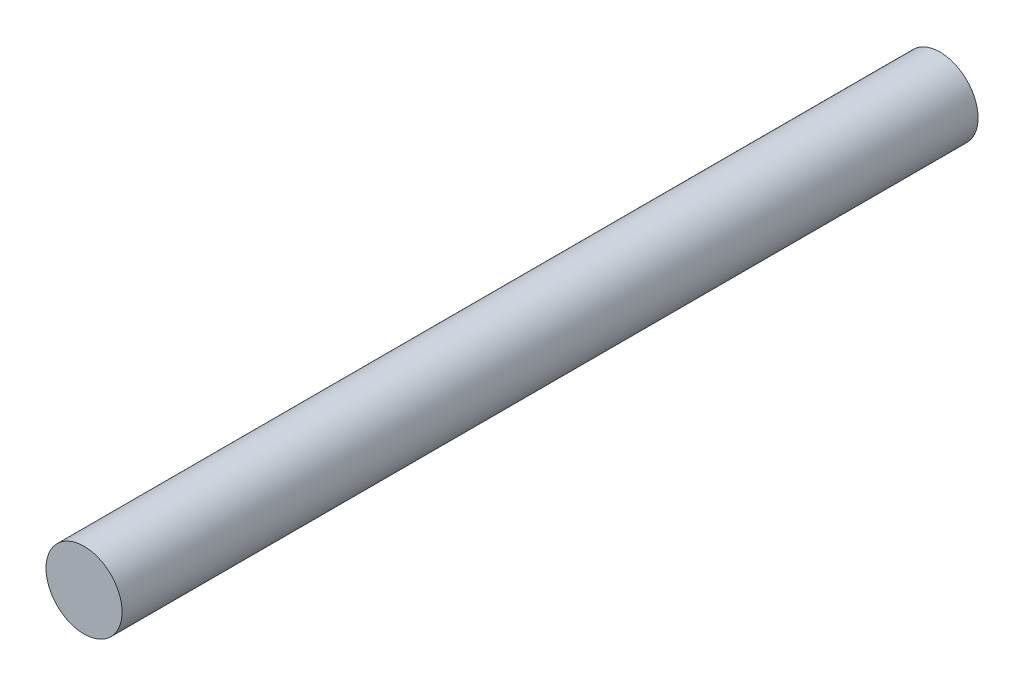
ISO-10303-21;
HEADER;
FILE_DESCRIPTION(('STEP AP214'),'2;1');
FILE_NAME('part.step','',(''),(''),'','','');
FILE_SCHEMA(('AUTOMOTIVE_DESIGN { 1 0 10303 214 1 1 1 1 }'));
ENDSEC;
DATA;
#1=APPLICATION_CONTEXT('core data for automotive mechanical design processes');
#2=APPLICATION_PROTOCOL_DEFINITION('international standard','automotive_design',2000,#1);
#3=PRODUCT_CONTEXT('',#1,'mechanical');
#4=PRODUCT('Part','Part','',(#3));
#5=PRODUCT_RELATED_PRODUCT_CATEGORY('part','',(#4));
#6=PRODUCT_DEFINITION_FORMATION('','',#4);
#7=PRODUCT_DEFINITION_CONTEXT('part definition',#1,'design');
#8=PRODUCT_DEFINITION('design','',#6,#7);
#9=PRODUCT_DEFINITION_SHAPE('','',#8);
#10=(LENGTH_UNIT() NAMED_UNIT(*) SI_UNIT(.MILLI.,.METRE.));
#11=(NAMED_UNIT(*) PLANE_ANGLE_UNIT() SI_UNIT($,.RADIAN.));
#12=(NAMED_UNIT(*) SI_UNIT($,.STERADIAN.) SOLID_ANGLE_UNIT());
#13=UNCERTAINTY_MEASURE_WITH_UNIT(LENGTH_MEASURE(1.E-05),#10,'distance_accuracy_value','');
#14=(GEOMETRIC_REPRESENTATION_CONTEXT(3) GLOBAL_UNCERTAINTY_ASSIGNED_CONTEXT((#13)) GLOBAL_UNIT_ASSIGNED_CONTEXT((#10,
#11,#12)) REPRESENTATION_CONTEXT('',''));
#15=CARTESIAN_POINT('',(0.,0.,0.));
#16=DIRECTION('',(0.,0.,1.));
#17=DIRECTION('',(1.,0.,0.));
#18=AXIS2_PLACEMENT_3D('',#15,#16,#17);
#19=CARTESIAN_POINT('',(0.,0.,45.));
#20=DIRECTION('',(0.,0.,-1.));
#21=DIRECTION('',(-1.,0.,0.));
#22=AXIS2_PLACEMENT_3D('',#19,#20,#21);
#23=CYLINDRICAL_SURFACE('',#22,2.);
#24=CARTESIAN_POINT('',(0.,0.,45.));
#25=DIRECTION('',(0.,0.,1.));
#26=DIRECTION('',(1.,0.,0.));
#27=AXIS2_PLACEMENT_3D('',#24,#25,#26);
#28=CIRCLE('',#27,2.);
#29=CARTESIAN_POINT('',(-2.,0.,45.));
#30=VERTEX_POINT('',#29);
#31=EDGE_CURVE('E10',#30,#30,#28,.T.);
#32=CARTESIAN_POINT('',(0.,0.,0.));
#33=DIRECTION('',(0.,0.,1.));
#34=DIRECTION('',(1.,0.,0.));
#35=AXIS2_PLACEMENT_3D('',#32,#33,#34);
#36=CIRCLE('',#35,2.);
#37=CARTESIAN_POINT('',(-2.,0.,0.));
#38=VERTEX_POINT('',#37);
#39=EDGE_CURVE('E34',#38,#38,#36,.T.);
#40=CARTESIAN_POINT('',(-2.,0.,45.));
#41=CARTESIAN_POINT('',(-2.,0.,44.53125));
#42=CARTESIAN_POINT('',(-2.,0.,44.0625));
#43=CARTESIAN_POINT('',(-2.,0.,43.125));
#44=CARTESIAN_POINT('',(-2.,0.,42.65625));
#45=CARTESIAN_POINT('',(-2.,0.,41.71875));
#46=CARTESIAN_POINT('',(-2.,0.,41.25));
#47=CARTESIAN_POINT('',(-2.,0.,40.3125));
#48=CARTESIAN_POINT('',(-2.,0.,39.84375));
#49=CARTESIAN_POINT('',(-2.,0.,38.90625));
#50=CARTESIAN_POINT('',(-2.,0.,38.4375));
#51=CARTESIAN_POINT('',(-2.,0.,37.5));
#52=CARTESIAN_POINT('',(-2.,0.,37.03125));
#53=CARTESIAN_POINT('',(-2.,0.,36.09375));
#54=CARTESIAN_POINT('',(-2.,0.,35.625));
#55=CARTESIAN_POINT('',(-2.,0.,34.6875));
#56=CARTESIAN_POINT('',(-2.,0.,34.21875));
#57=CARTESIAN_POINT('',(-2.,0.,33.28125));
#58=CARTESIAN_POINT('',(-2.,0.,32.8125));
#59=CARTESIAN_POINT('',(-2.,0.,31.875));
#60=CARTESIAN_POINT('',(-2.,0.,31.40625));
#61=CARTESIAN_POINT('',(-2.,0.,30.46875));
#62=CARTESIAN_POINT('',(-2.,0.,30.));
#63=CARTESIAN_POINT('',(-2.,0.,29.0625));
#64=CARTESIAN_POINT('',(-2.,0.,28.59375));
#65=CARTESIAN_POINT('',(-2.,0.,27.65625));
#66=CARTESIAN_POINT('',(-2.,0.,27.1875));
#67=CARTESIAN_POINT('',(-2.,0.,26.25));
#68=CARTESIAN_POINT('',(-2.,0.,25.78125));
#69=CARTESIAN_POINT('',(-2.,0.,24.84375));
#70=CARTESIAN_POINT('',(-2.,0.,24.375));
#71=CARTESIAN_POINT('',(-2.,0.,23.4375));
#72=CARTESIAN_POINT('',(-2.,0.,22.96875));
#73=CARTESIAN_POINT('',(-2.,0.,22.03125));
#74=CARTESIAN_POINT('',(-2.,0.,21.5625));
#75=CARTESIAN_POINT('',(-2.,0.,20.625));
#76=CARTESIAN_POINT('',(-2.,0.,20.15625));
#77=CARTESIAN_POINT('',(-2.,0.,19.21875));
#78=CARTESIAN_POINT('',(-2.,0.,18.75));
#79=CARTESIAN_POINT('',(-2.,0.,17.8125));
#80=CARTESIAN_POINT('',(-2.,0.,17.34375));
#81=CARTESIAN_POINT('',(-2.,0.,16.40625));
#82=CARTESIAN_POINT('',(-2.,0.,15.9375));
#83=CARTESIAN_POINT('',(-2.,0.,15.));
#84=CARTESIAN_POINT('',(-2.,0.,14.53125));
#85=CARTESIAN_POINT('',(-2.,0.,13.59375));
#86=CARTESIAN_POINT('',(-2.,0.,13.125));
#87=CARTESIAN_POINT('',(-2.,0.,12.1875));
#88=CARTESIAN_POINT('',(-2.,0.,11.71875));
#89=CARTESIAN_POINT('',(-2.,0.,10.78125));
#90=CARTESIAN_POINT('',(-2.,0.,10.3125));
#91=CARTESIAN_POINT('',(-2.,0.,9.37499999999999));
#92=CARTESIAN_POINT('',(-2.,0.,8.90624999999999));
#93=CARTESIAN_POINT('',(-2.,0.,7.96874999999999));
#94=CARTESIAN_POINT('',(-2.,0.,7.5));
#95=CARTESIAN_POINT('',(-2.,0.,6.56249999999999));
#96=CARTESIAN_POINT('',(-2.,0.,6.09374999999999));
#97=CARTESIAN_POINT('',(-2.,0.,5.15624999999999));
#98=CARTESIAN_POINT('',(-2.,0.,4.68749999999999));
#99=CARTESIAN_POINT('',(-2.,0.,3.74999999999999));
#100=CARTESIAN_POINT('',(-2.,0.,3.28124999999999));
#101=CARTESIAN_POINT('',(-2.,0.,2.34374999999999));
#102=CARTESIAN_POINT('',(-2.,0.,1.87499999999999));
#103=CARTESIAN_POINT('',(-2.,0.,0.937499999999992));
#104=CARTESIAN_POINT('',(-2.,0.,0.468749999999993));
#105=CARTESIAN_POINT('',(-2.,0.,0.));
#106=B_SPLINE_CURVE_WITH_KNOTS('',3,(#40,#41,#42,#43,#44,#45,#46,#47,#48,#49,#50,#51,#52,#53,
#54,#55,#56,#57,#58,#59,#60,#61,#62,#63,#64,#65,#66,#67,#68,#69,#70,#71,#72,#73,#74,#75,#76,#77,
#78,#79,#80,#81,#82,#83,#84,#85,#86,#87,#88,#89,#90,#91,#92,#93,#94,#95,#96,#97,#98,#99,#100,
#101,#102,#103,#104,#105),.UNSPECIFIED.,.F.,.F.,(4,2,2,2,2,2,2,2,2,2,2,2,2,2,2,2,2,2,2,2,2,2,2,
2,2,2,2,2,2,2,2,2,4),(0.,1.40625,2.8125,4.21874999999999,5.625,7.03125,8.43749999999999,9.84375,
11.25,12.65625,14.0625,15.46875,16.875,18.28125,19.6875,21.09375,22.5,23.90625,25.3125,26.71875,
28.125,29.53125,30.9375,32.34375,33.75,35.15625,36.5625,37.96875,39.375,40.78125,42.1875,
43.59375,45.),.UNSPECIFIED.);
#107=EDGE_CURVE('BSEAM31',#30,#38,#106,.T.);
#108=ORIENTED_EDGE('',*,*,#31,.F.);
#109=ORIENTED_EDGE('',*,*,#39,.T.);
#110=ORIENTED_EDGE('',*,*,#107,.T.);
#111=ORIENTED_EDGE('',*,*,#107,.F.);
#112=EDGE_LOOP('',(#108,#110,#109,#111));
#113=FACE_BOUND('',#112,.T.);
#114=ADVANCED_FACE('F31',(#113),#23,.T.);
#115=CARTESIAN_POINT('',(0.,0.,45.));
#116=DIRECTION('',(0.,0.,1.));
#117=DIRECTION('',(1.,0.,0.));
#118=AXIS2_PLACEMENT_3D('',#115,#116,#117);
#119=PLANE('',#118);
#120=ORIENTED_EDGE('',*,*,#31,.T.);
#121=EDGE_LOOP('',(#120));
#122=FACE_BOUND('',#121,.T.);
#123=ADVANCED_FACE('F46',(#122),#119,.T.);
#124=CARTESIAN_POINT('',(0.,0.,0.));
#125=DIRECTION('',(0.,0.,1.));
#126=DIRECTION('',(1.,0.,0.));
#127=AXIS2_PLACEMENT_3D('',#124,#125,#126);
#128=PLANE('',#127);
#129=ORIENTED_EDGE('',*,*,#39,.F.);
#130=EDGE_LOOP('',(#129));
#131=FACE_BOUND('',#130,.T.);
#132=ADVANCED_FACE('F44',(#131),#128,.F.);
#133=CLOSED_SHELL('',(#114,#123,#132));
#134=MANIFOLD_SOLID_BREP('B2',#133);
#135=ADVANCED_BREP_SHAPE_REPRESENTATION('',(#18,#134),#14);
#136=SHAPE_DEFINITION_REPRESENTATION(#9,#135);
ENDSEC;
END-ISO-10303-21;
